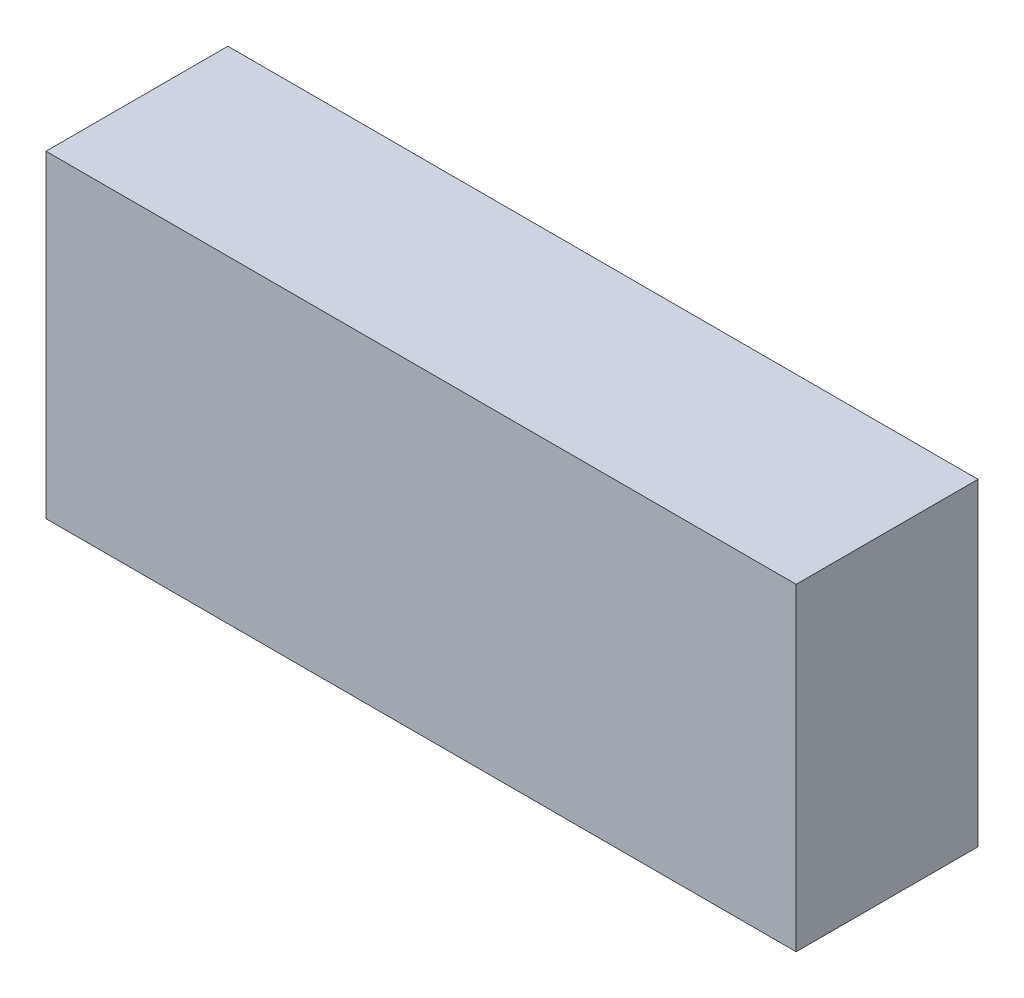
ISO-10303-21;
HEADER;
FILE_DESCRIPTION(('STEP AP214'),'2;1');
FILE_NAME('part.step','',(''),(''),'','','');
FILE_SCHEMA(('AUTOMOTIVE_DESIGN { 1 0 10303 214 1 1 1 1 }'));
ENDSEC;
DATA;
#1=APPLICATION_CONTEXT('core data for automotive mechanical design processes');
#2=APPLICATION_PROTOCOL_DEFINITION('international standard','automotive_design',2000,#1);
#3=PRODUCT_CONTEXT('',#1,'mechanical');
#4=PRODUCT('Part','Part','',(#3));
#5=PRODUCT_RELATED_PRODUCT_CATEGORY('part','',(#4));
#6=PRODUCT_DEFINITION_FORMATION('','',#4);
#7=PRODUCT_DEFINITION_CONTEXT('part definition',#1,'design');
#8=PRODUCT_DEFINITION('design','',#6,#7);
#9=PRODUCT_DEFINITION_SHAPE('','',#8);
#10=(LENGTH_UNIT() NAMED_UNIT(*) SI_UNIT(.MILLI.,.METRE.));
#11=(NAMED_UNIT(*) PLANE_ANGLE_UNIT() SI_UNIT($,.RADIAN.));
#12=(NAMED_UNIT(*) SI_UNIT($,.STERADIAN.) SOLID_ANGLE_UNIT());
#13=UNCERTAINTY_MEASURE_WITH_UNIT(LENGTH_MEASURE(1.E-05),#10,'distance_accuracy_value','');
#14=(GEOMETRIC_REPRESENTATION_CONTEXT(3) GLOBAL_UNCERTAINTY_ASSIGNED_CONTEXT((#13)) GLOBAL_UNIT_ASSIGNED_CONTEXT((#10,
#11,#12)) REPRESENTATION_CONTEXT('',''));
#15=CARTESIAN_POINT('',(0.,0.,0.));
#16=DIRECTION('',(0.,0.,1.));
#17=DIRECTION('',(1.,0.,0.));
#18=AXIS2_PLACEMENT_3D('',#15,#16,#17);
#19=CARTESIAN_POINT('',(0.,0.,0.8));
#20=DIRECTION('',(0.,0.,1.));
#21=DIRECTION('',(1.,0.,0.));
#22=AXIS2_PLACEMENT_3D('',#19,#20,#21);
#23=PLANE('',#22);
#24=DIRECTION('',(1.,0.,0.));
#25=VECTOR('',#24,1.);
#26=CARTESIAN_POINT('',(-1.65,-0.7,0.8));
#27=LINE('',#26,#25);
#28=CARTESIAN_POINT('',(-1.65,-0.7,0.8));
#29=VERTEX_POINT('',#28);
#30=CARTESIAN_POINT('',(1.65,-0.7,0.8));
#31=VERTEX_POINT('',#30);
#32=EDGE_CURVE('E81',#29,#31,#27,.T.);
#33=ORIENTED_EDGE('',*,*,#32,.T.);
#34=DIRECTION('',(0.,1.,0.));
#35=VECTOR('',#34,1.);
#36=CARTESIAN_POINT('',(1.65,-0.7,0.8));
#37=LINE('',#36,#35);
#38=CARTESIAN_POINT('',(1.65,0.7,0.8));
#39=VERTEX_POINT('',#38);
#40=EDGE_CURVE('E67',#31,#39,#37,.T.);
#41=ORIENTED_EDGE('',*,*,#40,.T.);
#42=DIRECTION('',(-1.,0.,0.));
#43=VECTOR('',#42,1.);
#44=CARTESIAN_POINT('',(1.65,0.7,0.8));
#45=LINE('',#44,#43);
#46=CARTESIAN_POINT('',(-1.65,0.7,0.8));
#47=VERTEX_POINT('',#46);
#48=EDGE_CURVE('E97',#39,#47,#45,.T.);
#49=ORIENTED_EDGE('',*,*,#48,.T.);
#50=DIRECTION('',(0.,-1.,0.));
#51=VECTOR('',#50,1.);
#52=CARTESIAN_POINT('',(-1.65,0.7,0.8));
#53=LINE('',#52,#51);
#54=EDGE_CURVE('E11',#47,#29,#53,.T.);
#55=ORIENTED_EDGE('',*,*,#54,.T.);
#56=EDGE_LOOP('',(#33,#41,#49,#55));
#57=FACE_BOUND('',#56,.T.);
#58=ADVANCED_FACE('F16',(#57),#23,.T.);
#59=CARTESIAN_POINT('',(0.,0.,0.));
#60=DIRECTION('',(0.,0.,1.));
#61=DIRECTION('',(1.,0.,0.));
#62=AXIS2_PLACEMENT_3D('',#59,#60,#61);
#63=PLANE('',#62);
#64=DIRECTION('',(1.,0.,0.));
#65=VECTOR('',#64,1.);
#66=CARTESIAN_POINT('',(-1.65,-0.7,0.));
#67=LINE('',#66,#65);
#68=CARTESIAN_POINT('',(-1.65,-0.7,0.));
#69=VERTEX_POINT('',#68);
#70=CARTESIAN_POINT('',(1.65,-0.7,0.));
#71=VERTEX_POINT('',#70);
#72=EDGE_CURVE('E87',#69,#71,#67,.T.);
#73=ORIENTED_EDGE('',*,*,#72,.F.);
#74=DIRECTION('',(0.,-1.,0.));
#75=VECTOR('',#74,1.);
#76=CARTESIAN_POINT('',(-1.65,0.7,0.));
#77=LINE('',#76,#75);
#78=CARTESIAN_POINT('',(-1.65,0.7,0.));
#79=VERTEX_POINT('',#78);
#80=EDGE_CURVE('E26',#79,#69,#77,.T.);
#81=ORIENTED_EDGE('',*,*,#80,.F.);
#82=DIRECTION('',(-1.,0.,0.));
#83=VECTOR('',#82,1.);
#84=CARTESIAN_POINT('',(1.65,0.7,0.));
#85=LINE('',#84,#83);
#86=CARTESIAN_POINT('',(1.65,0.7,0.));
#87=VERTEX_POINT('',#86);
#88=EDGE_CURVE('E78',#87,#79,#85,.T.);
#89=ORIENTED_EDGE('',*,*,#88,.F.);
#90=DIRECTION('',(0.,1.,0.));
#91=VECTOR('',#90,1.);
#92=CARTESIAN_POINT('',(1.65,-0.7,0.));
#93=LINE('',#92,#91);
#94=EDGE_CURVE('E20',#71,#87,#93,.T.);
#95=ORIENTED_EDGE('',*,*,#94,.F.);
#96=EDGE_LOOP('',(#73,#81,#89,#95));
#97=FACE_BOUND('',#96,.T.);
#98=ADVANCED_FACE('F116',(#97),#63,.F.);
#99=CARTESIAN_POINT('',(-1.65,0.7,0.));
#100=DIRECTION('',(1.,0.,0.));
#101=DIRECTION('',(0.,1.,0.));
#102=AXIS2_PLACEMENT_3D('',#99,#100,#101);
#103=PLANE('',#102);
#104=DIRECTION('',(0.,0.,1.));
#105=VECTOR('',#104,1.);
#106=CARTESIAN_POINT('',(-1.65,0.7,0.));
#107=LINE('',#106,#105);
#108=EDGE_CURVE('E99',#79,#47,#107,.T.);
#109=ORIENTED_EDGE('',*,*,#108,.F.);
#110=ORIENTED_EDGE('',*,*,#80,.T.);
#111=DIRECTION('',(0.,0.,1.));
#112=VECTOR('',#111,1.);
#113=CARTESIAN_POINT('',(-1.65,-0.7,0.));
#114=LINE('',#113,#112);
#115=EDGE_CURVE('E92',#69,#29,#114,.T.);
#116=ORIENTED_EDGE('',*,*,#115,.T.);
#117=ORIENTED_EDGE('',*,*,#54,.F.);
#118=EDGE_LOOP('',(#109,#110,#116,#117));
#119=FACE_BOUND('',#118,.T.);
#120=ADVANCED_FACE('F18',(#119),#103,.F.);
#121=CARTESIAN_POINT('',(1.65,0.7,0.));
#122=DIRECTION('',(0.,-1.,0.));
#123=DIRECTION('',(0.,0.,-1.));
#124=AXIS2_PLACEMENT_3D('',#121,#122,#123);
#125=PLANE('',#124);
#126=DIRECTION('',(0.,0.,1.));
#127=VECTOR('',#126,1.);
#128=CARTESIAN_POINT('',(1.65,0.7,0.));
#129=LINE('',#128,#127);
#130=EDGE_CURVE('E75',#87,#39,#129,.T.);
#131=ORIENTED_EDGE('',*,*,#130,.F.);
#132=ORIENTED_EDGE('',*,*,#88,.T.);
#133=ORIENTED_EDGE('',*,*,#108,.T.);
#134=ORIENTED_EDGE('',*,*,#48,.F.);
#135=EDGE_LOOP('',(#131,#132,#133,#134));
#136=FACE_BOUND('',#135,.T.);
#137=ADVANCED_FACE('F118',(#136),#125,.F.);
#138=CARTESIAN_POINT('',(1.65,-0.7,0.));
#139=DIRECTION('',(-1.,0.,0.));
#140=DIRECTION('',(0.,0.,1.));
#141=AXIS2_PLACEMENT_3D('',#138,#139,#140);
#142=PLANE('',#141);
#143=DIRECTION('',(0.,0.,1.));
#144=VECTOR('',#143,1.);
#145=CARTESIAN_POINT('',(1.65,-0.7,0.));
#146=LINE('',#145,#144);
#147=EDGE_CURVE('E72',#71,#31,#146,.T.);
#148=ORIENTED_EDGE('',*,*,#147,.F.);
#149=ORIENTED_EDGE('',*,*,#94,.T.);
#150=ORIENTED_EDGE('',*,*,#130,.T.);
#151=ORIENTED_EDGE('',*,*,#40,.F.);
#152=EDGE_LOOP('',(#148,#149,#150,#151));
#153=FACE_BOUND('',#152,.T.);
#154=ADVANCED_FACE('F69',(#153),#142,.F.);
#155=CARTESIAN_POINT('',(-1.65,-0.7,0.));
#156=DIRECTION('',(0.,1.,0.));
#157=DIRECTION('',(1.,0.,0.));
#158=AXIS2_PLACEMENT_3D('',#155,#156,#157);
#159=PLANE('',#158);
#160=ORIENTED_EDGE('',*,*,#115,.F.);
#161=ORIENTED_EDGE('',*,*,#72,.T.);
#162=ORIENTED_EDGE('',*,*,#147,.T.);
#163=ORIENTED_EDGE('',*,*,#32,.F.);
#164=EDGE_LOOP('',(#160,#161,#162,#163));
#165=FACE_BOUND('',#164,.T.);
#166=ADVANCED_FACE('F86',(#165),#159,.F.);
#167=CLOSED_SHELL('',(#58,#98,#120,#137,#154,#166));
#168=MANIFOLD_SOLID_BREP('B1',#167);
#169=ADVANCED_BREP_SHAPE_REPRESENTATION('',(#18,#168),#14);
#170=SHAPE_DEFINITION_REPRESENTATION(#9,#169);
ENDSEC;
END-ISO-10303-21;
